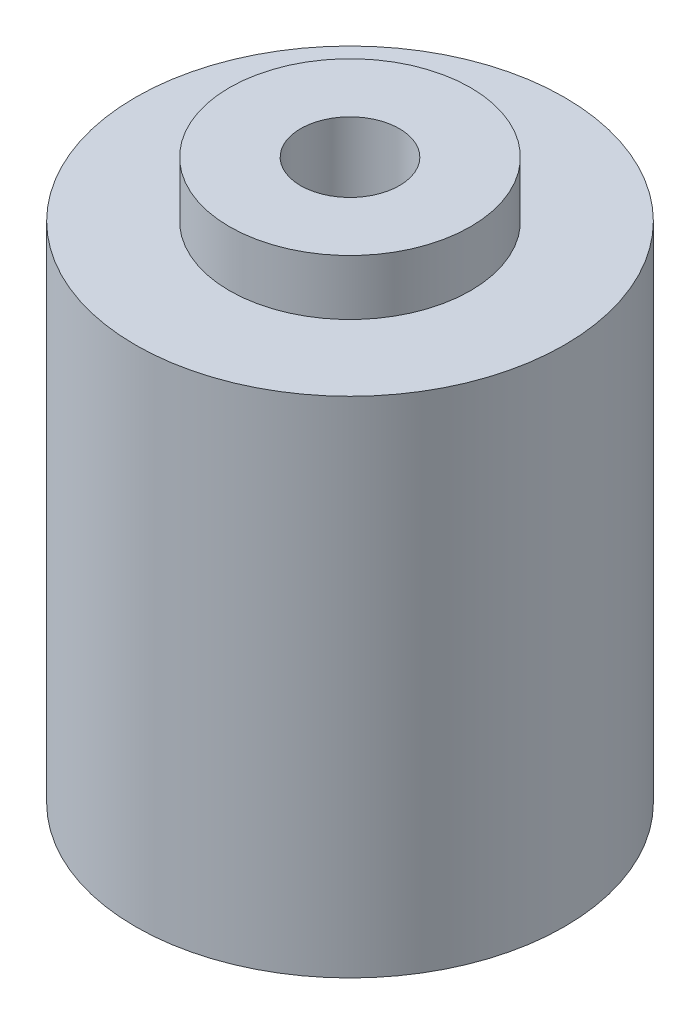
ISO-10303-21;
HEADER;
FILE_DESCRIPTION(('STEP AP214'),'2;1');
FILE_NAME('part.step','',(''),(''),'','','');
FILE_SCHEMA(('AUTOMOTIVE_DESIGN { 1 0 10303 214 1 1 1 1 }'));
ENDSEC;
DATA;
#1=APPLICATION_CONTEXT('core data for automotive mechanical design processes');
#2=APPLICATION_PROTOCOL_DEFINITION('international standard','automotive_design',2000,#1);
#3=PRODUCT_CONTEXT('',#1,'mechanical');
#4=PRODUCT('Part','Part','',(#3));
#5=PRODUCT_RELATED_PRODUCT_CATEGORY('part','',(#4));
#6=PRODUCT_DEFINITION_FORMATION('','',#4);
#7=PRODUCT_DEFINITION_CONTEXT('part definition',#1,'design');
#8=PRODUCT_DEFINITION('design','',#6,#7);
#9=PRODUCT_DEFINITION_SHAPE('','',#8);
#10=(LENGTH_UNIT() NAMED_UNIT(*) SI_UNIT(.MILLI.,.METRE.));
#11=(NAMED_UNIT(*) PLANE_ANGLE_UNIT() SI_UNIT($,.RADIAN.));
#12=(NAMED_UNIT(*) SI_UNIT($,.STERADIAN.) SOLID_ANGLE_UNIT());
#13=UNCERTAINTY_MEASURE_WITH_UNIT(LENGTH_MEASURE(1.E-05),#10,'distance_accuracy_value','');
#14=(GEOMETRIC_REPRESENTATION_CONTEXT(3) GLOBAL_UNCERTAINTY_ASSIGNED_CONTEXT((#13)) GLOBAL_UNIT_ASSIGNED_CONTEXT((#10,
#11,#12)) REPRESENTATION_CONTEXT('',''));
#15=CARTESIAN_POINT('',(0.,0.,0.));
#16=DIRECTION('',(0.,0.,1.));
#17=DIRECTION('',(1.,0.,0.));
#18=AXIS2_PLACEMENT_3D('',#15,#16,#17);
#19=CARTESIAN_POINT('',(0.,56.642,0.));
#20=DIRECTION('',(0.,1.,0.));
#21=DIRECTION('',(0.,0.,1.));
#22=AXIS2_PLACEMENT_3D('',#19,#20,#21);
#23=PLANE('',#22);
#24=CARTESIAN_POINT('',(0.,56.642,0.));
#25=DIRECTION('',(0.,1.,0.));
#26=DIRECTION('',(0.,0.,1.));
#27=AXIS2_PLACEMENT_3D('',#24,#25,#26);
#28=CIRCLE('',#27,12.7);
#29=CARTESIAN_POINT('',(0.,56.642,12.7));
#30=VERTEX_POINT('',#29);
#31=EDGE_CURVE('E44',#30,#30,#28,.T.);
#32=ORIENTED_EDGE('',*,*,#31,.T.);
#33=EDGE_LOOP('',(#32));
#34=FACE_BOUND('',#33,.T.);
#35=CARTESIAN_POINT('',(0.,56.642,0.));
#36=DIRECTION('',(0.,1.,0.));
#37=DIRECTION('',(0.,0.,1.));
#38=AXIS2_PLACEMENT_3D('',#35,#36,#37);
#39=CIRCLE('',#38,5.207);
#40=CARTESIAN_POINT('',(0.,56.642,5.207));
#41=VERTEX_POINT('',#40);
#42=EDGE_CURVE('E78',#41,#41,#39,.F.);
#43=ORIENTED_EDGE('',*,*,#42,.T.);
#44=EDGE_LOOP('',(#43));
#45=FACE_BOUND('',#44,.T.);
#46=ADVANCED_FACE('F31',(#34,#45),#23,.T.);
#47=CARTESIAN_POINT('',(-31.242,40.0328485354983,0.));
#48=DIRECTION('',(1.,0.,0.));
#49=DIRECTION('',(0.,0.,-1.));
#50=AXIS2_PLACEMENT_3D('',#47,#48,#49);
#51=CYLINDRICAL_SURFACE('',#50,2.54);
#52=CARTESIAN_POINT('',(-22.4628501308271,40.0328485354983,-2.54));
#53=CARTESIAN_POINT('',(-22.4628519874032,40.1750374701047,-2.53999389104045));
#54=CARTESIAN_POINT('',(-22.4642147681655,40.3173180215167,-2.52802016972046));
#55=CARTESIAN_POINT('',(-22.4695172855281,40.5979273938752,-2.48043944163731));
#56=CARTESIAN_POINT('',(-22.4734597933094,40.7362517981062,-2.44480701974101));
#57=CARTESIAN_POINT('',(-22.4834696868973,41.0048450130348,-2.35096567384199));
#58=CARTESIAN_POINT('',(-22.4895357124486,41.1351189179149,-2.29277119978632));
#59=CARTESIAN_POINT('',(-22.5031074986739,41.38402452736,-2.15548698602891));
#60=CARTESIAN_POINT('',(-22.5106129919763,41.5026583878112,-2.07640112573769));
#61=CARTESIAN_POINT('',(-22.5262562894873,41.7254825253512,-1.89919307726948));
#62=CARTESIAN_POINT('',(-22.5343965351617,41.8296122598768,-1.80099496957232));
#63=CARTESIAN_POINT('',(-22.5503700816941,42.0199501473025,-1.58851282916985));
#64=CARTESIAN_POINT('',(-22.558203367931,42.1061574473597,-1.47422803140955));
#65=CARTESIAN_POINT('',(-22.5727049836061,42.2584167780123,-1.23244064958391));
#66=CARTESIAN_POINT('',(-22.5793701591329,42.3244145907264,-1.10490371796254));
#67=CARTESIAN_POINT('',(-22.5907578606671,42.4340344788173,-0.840469942861167));
#68=CARTESIAN_POINT('',(-22.5954804455468,42.4776572323034,-0.70357338318103));
#69=CARTESIAN_POINT('',(-22.6024336894632,42.5411094012492,-0.424922198369808));
#70=CARTESIAN_POINT('',(-22.6046748304237,42.5610389263467,-0.283190635107517));
#71=CARTESIAN_POINT('',(-22.6064483926542,42.5768489032878,0.00162197906391579));
#72=CARTESIAN_POINT('',(-22.6059809011429,42.572730129494,0.144702986372428));
#73=CARTESIAN_POINT('',(-22.6023984038634,42.5406412030244,0.427472643970268));
#74=CARTESIAN_POINT('',(-22.5992953480279,42.5127787050554,0.567173683614366));
#75=CARTESIAN_POINT('',(-22.5908039642247,42.434161224935,0.839904193246917));
#76=CARTESIAN_POINT('',(-22.5854156000153,42.3834058797346,0.972933557394618));
#77=CARTESIAN_POINT('',(-22.5729386297922,42.260327089278,1.22888101614845));
#78=CARTESIAN_POINT('',(-22.5658463137905,42.1879564966942,1.3517762505811));
#79=CARTESIAN_POINT('',(-22.5507561788232,42.0237358066609,1.58371749551642));
#80=CARTESIAN_POINT('',(-22.5427583263015,41.931884987231,1.69276299247748));
#81=CARTESIAN_POINT('',(-22.5267013546533,41.7307068517803,1.89454081869313));
#82=CARTESIAN_POINT('',(-22.5186421411332,41.6212858031286,1.98717971158404));
#83=CARTESIAN_POINT('',(-22.5034146212583,41.3883968483323,2.15278996246178));
#84=CARTESIAN_POINT('',(-22.4962463168187,41.2649289119932,2.22576127817096));
#85=CARTESIAN_POINT('',(-22.4836119826784,41.0073738400633,2.34996722880334));
#86=CARTESIAN_POINT('',(-22.478146467629,40.8732835092873,2.40119529373448));
#87=CARTESIAN_POINT('',(-22.4695469380112,40.5983290833005,2.48038247849135));
#88=CARTESIAN_POINT('',(-22.4664128332573,40.4574652503318,2.50834249839377));
#89=CARTESIAN_POINT('',(-22.462847051124,40.1737850058522,2.54007806632914));
#90=CARTESIAN_POINT('',(-22.4624007269563,40.0309834351342,2.54398469351273));
#91=CARTESIAN_POINT('',(-22.4642223539586,39.7467597946001,2.5278475775035));
#92=CARTESIAN_POINT('',(-22.4664902586152,39.6053377011861,2.50780424473977));
#93=CARTESIAN_POINT('',(-22.4734714678958,39.3282745467152,2.44444616215503));
#94=CARTESIAN_POINT('',(-22.4781781853559,39.1926189730874,2.40119408734442));
#95=CARTESIAN_POINT('',(-22.4895013586218,38.9304871617648,2.29271051915275));
#96=CARTESIAN_POINT('',(-22.4961178691913,38.8040111874274,2.22747839547936));
#97=CARTESIAN_POINT('',(-22.5105504098808,38.5632333580757,2.07656090931601));
#98=CARTESIAN_POINT('',(-22.5183714582033,38.4489859884983,1.99078910681833));
#99=CARTESIAN_POINT('',(-22.5343157447023,38.2364625427017,1.80135010598468));
#100=CARTESIAN_POINT('',(-22.5424389923374,38.1381869668984,1.69768234715611));
#101=CARTESIAN_POINT('',(-22.5581169865897,37.9599408254114,1.47482367046936));
#102=CARTESIAN_POINT('',(-22.5656689622914,37.8800560620802,1.35556390401831));
#103=CARTESIAN_POINT('',(-22.5793126823684,37.7414511289438,1.10524415651504));
#104=CARTESIAN_POINT('',(-22.5854044512383,37.6827306041031,0.974184373457117));
#105=CARTESIAN_POINT('',(-22.5954289778261,37.5882646731895,0.704277664654601));
#106=CARTESIAN_POINT('',(-22.5993665041631,37.552468491692,0.565448694411506));
#107=CARTESIAN_POINT('',(-22.6046585772855,37.504701893486,0.283704081925971));
#108=CARTESIAN_POINT('',(-22.6060132170987,37.4927306186762,0.140788587055907));
#109=CARTESIAN_POINT('',(-22.605986658336,37.4929675593847,-0.144231820228776));
#110=CARTESIAN_POINT('',(-22.6046204828274,37.5050430001734,-0.286336862908438));
#111=CARTESIAN_POINT('',(-22.5993355218844,37.5527508693765,-0.566485231636046));
#112=CARTESIAN_POINT('',(-22.5954167360394,37.5883833015808,-0.704528557030542));
#113=CARTESIAN_POINT('',(-22.5854652391025,37.6821545375996,-0.972626159162659));
#114=CARTESIAN_POINT('',(-22.5794330037321,37.740288276849,-1.10268222603516));
#115=CARTESIAN_POINT('',(-22.5659249337232,37.877398082395,-1.35121278152815));
#116=CARTESIAN_POINT('',(-22.55844909544,37.9563742013131,-1.46968724090712));
#117=CARTESIAN_POINT('',(-22.5428405804059,38.1334221649662,-1.69237129060322));
#118=CARTESIAN_POINT('',(-22.5347046342477,38.2315929404367,-1.79650199861406));
#119=CARTESIAN_POINT('',(-22.5187199313993,38.444042025158,-1.98686672798467));
#120=CARTESIAN_POINT('',(-22.510871243632,38.5583241685561,-2.07309647720167));
#121=CARTESIAN_POINT('',(-22.4963233805864,38.8001558792157,-2.22543539264269));
#122=CARTESIAN_POINT('',(-22.4896278979147,38.9277460396272,-2.29148043089939));
#123=CARTESIAN_POINT('',(-22.4781880826128,39.1922043809881,-2.40111693582597));
#124=CARTESIAN_POINT('',(-22.4734415870136,39.3290620792577,-2.44473330727969));
#125=CARTESIAN_POINT('',(-22.4676135081654,39.5610286055879,-2.49759946996118));
#126=CARTESIAN_POINT('',(-22.4658358963525,39.6546631586349,-2.51347741489973));
#127=CARTESIAN_POINT('',(-22.4634535915994,39.8431343936707,-2.53467968811047));
#128=CARTESIAN_POINT('',(-22.4628488920019,39.9379710688331,-2.5400040762849));
#129=CARTESIAN_POINT('',(-22.4628501308271,40.0328485354983,-2.54));
#130=B_SPLINE_CURVE_WITH_KNOTS('',3,(#52,#53,#54,#55,#56,#57,#58,#59,#60,#61,#62,#63,#64,#65,
#66,#67,#68,#69,#70,#71,#72,#73,#74,#75,#76,#77,#78,#79,#80,#81,#82,#83,#84,#85,#86,#87,#88,#89,
#90,#91,#92,#93,#94,#95,#96,#97,#98,#99,#100,#101,#102,#103,#104,#105,#106,#107,#108,#109,#110,
#111,#112,#113,#114,#115,#116,#117,#118,#119,#120,#121,#122,#123,#124,#125,#126,#127,#128,#129),
.UNSPECIFIED.,.T.,.F.,(4,2,2,2,2,2,2,2,2,2,2,2,2,2,2,2,2,2,2,2,2,2,2,2,2,2,2,2,2,2,2,2,2,2,2,2,
2,2,4),(0.,0.426220270683095,0.852899146810548,1.27930520514525,1.70563213791538,
2.13368846656337,2.56176515970774,2.99098043086953,3.42018269325996,3.84756495267951,
4.27493345033565,4.70037449438917,5.1258222855882,5.55220492905823,5.9786033779786,
6.40735712896543,6.83611180159896,7.26499593568647,7.69386347849785,8.12039182070828,
8.54691285363164,8.97228782452974,9.39767499437269,9.82488485460679,10.2521080972729,
10.6812858854325,11.1104564736933,11.5386731684687,11.9668744398897,12.3927179393588,
12.8185615073376,13.2443092826801,13.6700581329324,14.0980620956674,14.5261680863067,
14.9556203839569,15.3845947825754,15.6689975679865,15.953398739116),.UNSPECIFIED.);
#131=CARTESIAN_POINT('',(-22.4628501308271,40.0328485354983,-2.54));
#132=VERTEX_POINT('',#131);
#133=EDGE_CURVE('E48',#132,#132,#130,.T.);
#134=ORIENTED_EDGE('',*,*,#133,.F.);
#135=EDGE_LOOP('',(#134));
#136=FACE_BOUND('',#135,.T.);
#137=CARTESIAN_POINT('',(-4.54546466271601,40.0328485354983,-2.54));
#138=CARTESIAN_POINT('',(-4.54547667675655,39.9000025587801,-2.53998988471664));
#139=CARTESIAN_POINT('',(-4.55137679808838,39.7669726341735,-2.52950821226168));
#140=CARTESIAN_POINT('',(-4.57414015223855,39.5049586782205,-2.48809442556826));
#141=CARTESIAN_POINT('',(-4.59102753532897,39.3759842171076,-2.45711725918423));
#142=CARTESIAN_POINT('',(-4.63334647815251,39.1263574526049,-2.37634116328109));
#143=CARTESIAN_POINT('',(-4.65873425737187,39.0056662490605,-2.32663851663548));
#144=CARTESIAN_POINT('',(-4.7151264153585,38.7743650737305,-2.21011495781394));
#145=CARTESIAN_POINT('',(-4.7461308599076,38.6637552200394,-2.14329384514439));
#146=CARTESIAN_POINT('',(-4.81323349005063,38.4461825415435,-1.98829032157754));
#147=CARTESIAN_POINT('',(-4.8495404302748,38.3401833759878,-1.89884501468683));
#148=CARTESIAN_POINT('',(-4.92146851791136,38.1439470166116,-1.7037623934225));
#149=CARTESIAN_POINT('',(-4.95708932977139,38.0537173690753,-1.59811737204997));
#150=CARTESIAN_POINT('',(-5.02633499270512,37.8859903546343,-1.36544256593427));
#151=CARTESIAN_POINT('',(-5.0596901138471,37.8096629201755,-1.23748162630202));
#152=CARTESIAN_POINT('',(-5.11796085631138,37.6800552114383,-0.968604679916625));
#153=CARTESIAN_POINT('',(-5.14288155052872,37.6267610783942,-0.827696525361274));
#154=CARTESIAN_POINT('',(-5.17997519210143,37.5484982202949,-0.547121451382447));
#155=CARTESIAN_POINT('',(-5.19290231168105,37.5218440365565,-0.40802660154889));
#156=CARTESIAN_POINT('',(-5.20735606322798,37.4920832208046,-0.126783441656181));
#157=CARTESIAN_POINT('',(-5.20888921577637,37.4889631206046,0.0153630752611582));
#158=CARTESIAN_POINT('',(-5.20075364726631,37.5056717556195,0.286069246976375));
#159=CARTESIAN_POINT('',(-5.19200266648174,37.5236202097392,0.414778690277974));
#160=CARTESIAN_POINT('',(-5.16564962015747,37.5786138675708,0.667087803810721));
#161=CARTESIAN_POINT('',(-5.14804689464034,37.615660495229,0.790687092289975));
#162=CARTESIAN_POINT('',(-5.10529998606409,37.7080827123572,1.03147569436116));
#163=CARTESIAN_POINT('',(-5.08005145109191,37.7637130969198,1.14854791693069));
#164=CARTESIAN_POINT('',(-5.02431887390253,37.8913940292473,1.37198701644195));
#165=CARTESIAN_POINT('',(-4.99383293297209,37.9634505350709,1.47834998870871));
#166=CARTESIAN_POINT('',(-4.92724131645636,38.1294940381142,1.68768429043921));
#167=CARTESIAN_POINT('',(-4.89087669235588,38.2248808794182,1.78946394263114));
#168=CARTESIAN_POINT('',(-4.81845469431621,38.4311065336682,1.97620732176552));
#169=CARTESIAN_POINT('',(-4.78239755408554,38.5419561510925,2.06115918911979));
#170=CARTESIAN_POINT('',(-4.7124280634561,38.783894577806,2.2166564664036));
#171=CARTESIAN_POINT('',(-4.67876283100497,38.9157860153195,2.2860750667633));
#172=CARTESIAN_POINT('',(-4.62073708832255,39.191415988001,2.40121595996187));
#173=CARTESIAN_POINT('',(-4.59636727702021,39.3351425048274,2.44696195623257));
#174=CARTESIAN_POINT('',(-4.5623122145383,39.6185528970546,2.50985067852113));
#175=CARTESIAN_POINT('',(-4.55163140627399,39.7576803183873,2.52894303886585));
#176=CARTESIAN_POINT('',(-4.54332099957662,40.0375295472541,2.54385073866861));
#177=CARTESIAN_POINT('',(-4.54568315304136,40.1782502910218,2.53968078871862));
#178=CARTESIAN_POINT('',(-4.56213881368828,40.442069967304,2.50997142011857));
#179=CARTESIAN_POINT('',(-4.57501555249265,40.5655062465647,2.48664705619096));
#180=CARTESIAN_POINT('',(-4.609288595841,40.8065011578108,2.42252327266023));
#181=CARTESIAN_POINT('',(-4.63068750064784,40.9240579835377,2.38171851919472));
#182=CARTESIAN_POINT('',(-4.68076779308422,41.1561446309945,2.28177814863591));
#183=CARTESIAN_POINT('',(-4.70974118189156,41.270280470391,2.22187937748644));
#184=CARTESIAN_POINT('',(-4.77142256389308,41.4875291529,2.08612828528941));
#185=CARTESIAN_POINT('',(-4.8041324539702,41.590636345287,2.01026784449467));
#186=CARTESIAN_POINT('',(-4.87427488923865,41.7957069643773,1.83420046598006));
#187=CARTESIAN_POINT('',(-4.91180685796537,41.8960794926536,1.73217186012291));
#188=CARTESIAN_POINT('',(-4.98396367575647,42.0787451603011,1.51207251238271));
#189=CARTESIAN_POINT('',(-5.01858768748697,42.1610331032453,1.39399717536145));
#190=CARTESIAN_POINT('',(-5.08202694936583,42.3066433301596,1.14154748141194));
#191=CARTESIAN_POINT('',(-5.11069964287749,42.3695146868678,1.00687472702268));
#192=CARTESIAN_POINT('',(-5.15793451468967,42.4711013807979,0.727065482416313));
#193=CARTESIAN_POINT('',(-5.17650514175679,42.5098369077457,0.581937851441876));
#194=CARTESIAN_POINT('',(-5.20015406712463,42.5588658680853,0.299259979511798));
#195=CARTESIAN_POINT('',(-5.20628442288042,42.5713803085026,0.162181933379557));
#196=CARTESIAN_POINT('',(-5.20759576105782,42.5740711346472,-0.112226661463704));
#197=CARTESIAN_POINT('',(-5.20278021110173,42.5642545947455,-0.24955711644069));
#198=CARTESIAN_POINT('',(-5.18335369590967,42.5240697300642,-0.511811269636983));
#199=CARTESIAN_POINT('',(-5.1693555465016,42.494986096665,-0.636981863135018));
#200=CARTESIAN_POINT('',(-5.13349270574902,42.4187710098086,-0.880487706609356));
#201=CARTESIAN_POINT('',(-5.11162683260573,42.3716368449402,-0.998821926603698));
#202=CARTESIAN_POINT('',(-5.06082492344598,42.2584641528885,-1.23112162645493));
#203=CARTESIAN_POINT('',(-5.0316201840543,42.1916852330737,-1.34466593450256));
#204=CARTESIAN_POINT('',(-4.96926370879988,42.0420668561959,-1.55942039050428));
#205=CARTESIAN_POINT('',(-4.93611015910619,41.9592200074899,-1.66062482678173));
#206=CARTESIAN_POINT('',(-4.86547257261836,41.7706399440889,-1.85796328948389));
#207=CARTESIAN_POINT('',(-4.82787669779465,41.6634789626035,-1.95269797783151));
#208=CARTESIAN_POINT('',(-4.75531643109364,41.43414729153,-2.12330563844394));
#209=CARTESIAN_POINT('',(-4.72035419651765,41.3119645081408,-2.19916326255816));
#210=CARTESIAN_POINT('',(-4.65653052431585,41.0517696788893,-2.33133716943511));
#211=CARTESIAN_POINT('',(-4.62783909740456,40.9134437172294,-2.38713048011731));
#212=CARTESIAN_POINT('',(-4.59351527000725,40.6992782944948,-2.4521520448008));
#213=CARTESIAN_POINT('',(-4.58353136844025,40.6268462844541,-2.47070604544838));
#214=CARTESIAN_POINT('',(-4.56685513367202,40.480281130321,-2.50139842437502));
#215=CARTESIAN_POINT('',(-4.56016046020363,40.4061492351085,-2.51354136454746));
#216=CARTESIAN_POINT('',(-4.55202192781275,40.2820405912778,-2.52823822637844));
#217=CARTESIAN_POINT('',(-4.54956892619652,40.2323400454628,-2.53264444414535));
#218=CARTESIAN_POINT('',(-4.54628798479975,40.1327178550284,-2.53852732324791));
#219=CARTESIAN_POINT('',(-4.54546014565615,40.0827961969087,-2.54000380316183));
#220=CARTESIAN_POINT('',(-4.54546466271601,40.0328485354983,-2.54));
#221=B_SPLINE_CURVE_WITH_KNOTS('',3,(#137,#138,#139,#140,#141,#142,#143,#144,#145,#146,#147,
#148,#149,#150,#151,#152,#153,#154,#155,#156,#157,#158,#159,#160,#161,#162,#163,#164,#165,#166,
#167,#168,#169,#170,#171,#172,#173,#174,#175,#176,#177,#178,#179,#180,#181,#182,#183,#184,#185,
#186,#187,#188,#189,#190,#191,#192,#193,#194,#195,#196,#197,#198,#199,#200,#201,#202,#203,#204,
#205,#206,#207,#208,#209,#210,#211,#212,#213,#214,#215,#216,#217,#218,#219,#220),.UNSPECIFIED.,
.T.,.F.,(4,2,2,2,2,2,2,2,2,2,2,2,2,2,2,2,2,2,2,2,2,2,2,2,2,2,2,2,2,2,2,2,2,2,2,2,2,2,2,2,2,4),
(0.,0.39833663098746,0.797551787196278,1.19474166522023,1.591936195394,2.02023030036498,
2.44872880167978,2.90439450454201,3.35978565772232,3.78408561265651,4.20814272895015,
4.59705940038754,4.98600507337178,5.38051867417794,5.77517560071154,6.20578525277129,
6.6366973109082,7.09269911652004,7.54824343867116,7.96832111267191,8.38813316858115,
8.76527583956718,9.14253367169152,9.53730801813841,9.93228367506939,10.3741796964669,
10.8162025267939,11.2678294878647,11.7190781520527,12.1302392799798,12.5412701717416,
12.9273320351728,13.3134519125922,13.7165572034974,14.1198483744969,14.5615231743914,
15.0035559168122,15.4563932875891,15.6823994002657,15.9082444771671,16.0580025032279,
16.2077698026484),.UNSPECIFIED.);
#222=CARTESIAN_POINT('',(-4.54546466271601,40.0328485354983,-2.54));
#223=VERTEX_POINT('',#222);
#224=EDGE_CURVE('E72',#223,#223,#221,.T.);
#225=ORIENTED_EDGE('',*,*,#224,.F.);
#226=EDGE_LOOP('',(#225));
#227=FACE_BOUND('',#226,.T.);
#228=ADVANCED_FACE('F61',(#136,#227),#51,.F.);
#229=CARTESIAN_POINT('',(-31.242,15.4281247214263,0.));
#230=DIRECTION('',(1.,0.,0.));
#231=DIRECTION('',(0.,0.,-1.));
#232=AXIS2_PLACEMENT_3D('',#229,#230,#231);
#233=CYLINDRICAL_SURFACE('',#232,2.54);
#234=CARTESIAN_POINT('',(-22.4628501308271,15.4281247214263,-2.54));
#235=CARTESIAN_POINT('',(-22.4628519874032,15.5703136560328,-2.53999389104045));
#236=CARTESIAN_POINT('',(-22.4642147681655,15.7125942074448,-2.52802016972046));
#237=CARTESIAN_POINT('',(-22.4695172855281,15.9932035798032,-2.48043944163731));
#238=CARTESIAN_POINT('',(-22.4734597933094,16.1315279840342,-2.44480701974101));
#239=CARTESIAN_POINT('',(-22.4834696868973,16.4001211989628,-2.35096567384199));
#240=CARTESIAN_POINT('',(-22.4895357124486,16.5303951038429,-2.29277119978632));
#241=CARTESIAN_POINT('',(-22.5031074986739,16.7793007132881,-2.15548698602891));
#242=CARTESIAN_POINT('',(-22.5106129919763,16.8979345737392,-2.0764011257377));
#243=CARTESIAN_POINT('',(-22.5262562894873,17.1207587112793,-1.89919307726949));
#244=CARTESIAN_POINT('',(-22.5343965351617,17.2248884458048,-1.80099496957233));
#245=CARTESIAN_POINT('',(-22.5503700816941,17.4152263332306,-1.58851282916985));
#246=CARTESIAN_POINT('',(-22.558203367931,17.5014336332877,-1.47422803140956));
#247=CARTESIAN_POINT('',(-22.5727049836061,17.6536929639403,-1.23244064958392));
#248=CARTESIAN_POINT('',(-22.5793701591329,17.7196907766544,-1.10490371796255));
#249=CARTESIAN_POINT('',(-22.5907578606671,17.8293106647453,-0.840469942861169));
#250=CARTESIAN_POINT('',(-22.5954804455468,17.8729334182314,-0.703573383181032));
#251=CARTESIAN_POINT('',(-22.6024336894632,17.9363855871773,-0.424922198369809));
#252=CARTESIAN_POINT('',(-22.6046748304237,17.9563151122747,-0.283190635107518));
#253=CARTESIAN_POINT('',(-22.6064483926542,17.9721250892158,0.0016219790639134));
#254=CARTESIAN_POINT('',(-22.6059809011429,17.968006315422,0.144702986372426));
#255=CARTESIAN_POINT('',(-22.6023984038634,17.9359173889525,0.427472643970264));
#256=CARTESIAN_POINT('',(-22.5992953480279,17.9080548909835,0.567173683614362));
#257=CARTESIAN_POINT('',(-22.5908039642247,17.8294374108631,0.839904193246913));
#258=CARTESIAN_POINT('',(-22.5854156000153,17.7786820656626,0.972933557394615));
#259=CARTESIAN_POINT('',(-22.5729386297922,17.6556032752061,1.22888101614844));
#260=CARTESIAN_POINT('',(-22.5658463137905,17.5832326826223,1.35177625058109));
#261=CARTESIAN_POINT('',(-22.5507561788232,17.419011992589,1.58371749551641));
#262=CARTESIAN_POINT('',(-22.5427583263015,17.327161173159,1.69276299247747));
#263=CARTESIAN_POINT('',(-22.5267013546533,17.1259830377084,1.89454081869313));
#264=CARTESIAN_POINT('',(-22.5186421411332,17.0165619890566,1.98717971158404));
#265=CARTESIAN_POINT('',(-22.5034146212583,16.7836730342603,2.15278996246178));
#266=CARTESIAN_POINT('',(-22.4962463168187,16.6602050979213,2.22576127817096));
#267=CARTESIAN_POINT('',(-22.4836119826784,16.4026500259913,2.34996722880334));
#268=CARTESIAN_POINT('',(-22.478146467629,16.2685596952153,2.40119529373448));
#269=CARTESIAN_POINT('',(-22.4695469380112,15.9936052692286,2.48038247849135));
#270=CARTESIAN_POINT('',(-22.4664128332573,15.8527414362599,2.50834249839377));
#271=CARTESIAN_POINT('',(-22.462847051124,15.5690611917803,2.54007806632914));
#272=CARTESIAN_POINT('',(-22.4624007269563,15.4262596210622,2.54398469351273));
#273=CARTESIAN_POINT('',(-22.4642223539586,15.1420359805282,2.5278475775035));
#274=CARTESIAN_POINT('',(-22.4664902586152,15.0006138871141,2.50780424473977));
#275=CARTESIAN_POINT('',(-22.4734714678958,14.7235507326432,2.44444616215503));
#276=CARTESIAN_POINT('',(-22.4781781853559,14.5878951590155,2.40119408734442));
#277=CARTESIAN_POINT('',(-22.4895013586218,14.3257633476929,2.29271051915276));
#278=CARTESIAN_POINT('',(-22.4961178691913,14.1992873733555,2.22747839547936));
#279=CARTESIAN_POINT('',(-22.5105504098808,13.9585095440038,2.07656090931602));
#280=CARTESIAN_POINT('',(-22.5183714582033,13.8442621744264,1.99078910681834));
#281=CARTESIAN_POINT('',(-22.5343157447023,13.6317387286297,1.80135010598468));
#282=CARTESIAN_POINT('',(-22.5424389923374,13.5334631528265,1.69768234715611));
#283=CARTESIAN_POINT('',(-22.5581169865897,13.3552170113394,1.47482367046936));
#284=CARTESIAN_POINT('',(-22.5656689622914,13.2753322480083,1.35556390401831));
#285=CARTESIAN_POINT('',(-22.5793126823684,13.1367273148718,1.10524415651504));
#286=CARTESIAN_POINT('',(-22.5854044512383,13.0780067900311,0.974184373457121));
#287=CARTESIAN_POINT('',(-22.5954289778261,12.9835408591176,0.704277664654605));
#288=CARTESIAN_POINT('',(-22.5993665041631,12.94774467762,0.56544869441151));
#289=CARTESIAN_POINT('',(-22.6046585772855,12.8999780794141,0.283704081925974));
#290=CARTESIAN_POINT('',(-22.6060132170987,12.8880068046043,0.14078858705591));
#291=CARTESIAN_POINT('',(-22.605986658336,12.8882437453127,-0.144231820228773));
#292=CARTESIAN_POINT('',(-22.6046204828274,12.9003191861014,-0.286336862908434));
#293=CARTESIAN_POINT('',(-22.5993355218844,12.9480270553046,-0.566485231636042));
#294=CARTESIAN_POINT('',(-22.5954167360394,12.9836594875088,-0.704528557030538));
#295=CARTESIAN_POINT('',(-22.5854652391025,13.0774307235276,-0.972626159162655));
#296=CARTESIAN_POINT('',(-22.5794330037321,13.135564462777,-1.10268222603516));
#297=CARTESIAN_POINT('',(-22.5659249337232,13.2726742683231,-1.35121278152814));
#298=CARTESIAN_POINT('',(-22.55844909544,13.3516503872411,-1.46968724090712));
#299=CARTESIAN_POINT('',(-22.5428405804059,13.5286983508942,-1.69237129060322));
#300=CARTESIAN_POINT('',(-22.5347046342477,13.6268691263647,-1.79650199861406));
#301=CARTESIAN_POINT('',(-22.5187199313993,13.839318211086,-1.98686672798468));
#302=CARTESIAN_POINT('',(-22.510871243632,13.9536003544842,-2.07309647720167));
#303=CARTESIAN_POINT('',(-22.4963233805864,14.1954320651438,-2.22543539264269));
#304=CARTESIAN_POINT('',(-22.4896278979147,14.3230222255553,-2.29148043089939));
#305=CARTESIAN_POINT('',(-22.4781880826128,14.5874805669161,-2.40111693582597));
#306=CARTESIAN_POINT('',(-22.4734415870136,14.7243382651858,-2.44473330727969));
#307=CARTESIAN_POINT('',(-22.4676135081654,14.9563047915159,-2.49759946996118));
#308=CARTESIAN_POINT('',(-22.4658358963525,15.049939344563,-2.51347741489973));
#309=CARTESIAN_POINT('',(-22.4634535915994,15.2384105795987,-2.53467968811047));
#310=CARTESIAN_POINT('',(-22.4628488920019,15.3332472547612,-2.5400040762849));
#311=CARTESIAN_POINT('',(-22.4628501308271,15.4281247214263,-2.54));
#312=B_SPLINE_CURVE_WITH_KNOTS('',3,(#234,#235,#236,#237,#238,#239,#240,#241,#242,#243,#244,
#245,#246,#247,#248,#249,#250,#251,#252,#253,#254,#255,#256,#257,#258,#259,#260,#261,#262,#263,
#264,#265,#266,#267,#268,#269,#270,#271,#272,#273,#274,#275,#276,#277,#278,#279,#280,#281,#282,
#283,#284,#285,#286,#287,#288,#289,#290,#291,#292,#293,#294,#295,#296,#297,#298,#299,#300,#301,
#302,#303,#304,#305,#306,#307,#308,#309,#310,#311),.UNSPECIFIED.,.T.,.F.,(4,2,2,2,2,2,2,2,2,2,2,
2,2,2,2,2,2,2,2,2,2,2,2,2,2,2,2,2,2,2,2,2,2,2,2,2,2,2,4),(0.,0.426220270683098,
0.852899146810544,1.27930520514524,1.70563213791537,2.13368846656336,2.56176515970774,
2.99098043086953,3.42018269325996,3.8475649526795,4.27493345033565,4.70037449438917,
5.1258222855882,5.55220492905821,5.9786033779786,6.40735712896543,6.83611180159895,
7.26499593568647,7.69386347849785,8.12039182070827,8.54691285363163,8.97228782452973,
9.39767499437269,9.82488485460679,10.2521080972729,10.6812858854325,11.1104564736933,
11.5386731684687,11.9668744398897,12.3927179393588,12.8185615073376,13.2443092826801,
13.6700581329324,14.0980620956674,14.5261680863067,14.9556203839569,15.3845947825754,
15.6689975679865,15.953398739116),.UNSPECIFIED.);
#313=CARTESIAN_POINT('',(-22.4628501308271,15.4281247214263,-2.54));
#314=VERTEX_POINT('',#313);
#315=EDGE_CURVE('E54',#314,#314,#312,.T.);
#316=ORIENTED_EDGE('',*,*,#315,.F.);
#317=EDGE_LOOP('',(#316));
#318=FACE_BOUND('',#317,.T.);
#319=CARTESIAN_POINT('',(-4.54546466271601,15.4281247214263,-2.54));
#320=CARTESIAN_POINT('',(-4.54547667675655,15.2952787447081,-2.53998988471664));
#321=CARTESIAN_POINT('',(-4.55137679808838,15.1622488201015,-2.52950821226168));
#322=CARTESIAN_POINT('',(-4.57414015223854,14.9002348641485,-2.48809442556826));
#323=CARTESIAN_POINT('',(-4.59102753532897,14.7712604030356,-2.45711725918423));
#324=CARTESIAN_POINT('',(-4.63334647815252,14.521633638533,-2.37634116328109));
#325=CARTESIAN_POINT('',(-4.65873425737187,14.4009424349885,-2.32663851663548));
#326=CARTESIAN_POINT('',(-4.7151264153585,14.1696412596585,-2.21011495781393));
#327=CARTESIAN_POINT('',(-4.74613085990761,14.0590314059675,-2.14329384514439));
#328=CARTESIAN_POINT('',(-4.81323349005063,13.8414587274715,-1.98829032157754));
#329=CARTESIAN_POINT('',(-4.8495404302748,13.7354595619159,-1.89884501468683));
#330=CARTESIAN_POINT('',(-4.92146851791136,13.5392232025397,-1.7037623934225));
#331=CARTESIAN_POINT('',(-4.95708932977139,13.4489935550034,-1.59811737204997));
#332=CARTESIAN_POINT('',(-5.02633499270512,13.2812665405623,-1.36544256593427));
#333=CARTESIAN_POINT('',(-5.0596901138471,13.2049391061036,-1.23748162630202));
#334=CARTESIAN_POINT('',(-5.11796085631138,13.0753313973663,-0.968604679916625));
#335=CARTESIAN_POINT('',(-5.14288155052872,13.0220372643222,-0.827696525361274));
#336=CARTESIAN_POINT('',(-5.17997519210143,12.9437744062229,-0.547121451382447));
#337=CARTESIAN_POINT('',(-5.19290231168105,12.9171202224845,-0.40802660154889));
#338=CARTESIAN_POINT('',(-5.20735606322798,12.8873594067327,-0.12678344165618));
#339=CARTESIAN_POINT('',(-5.20888921577637,12.8842393065326,0.0153630752611591));
#340=CARTESIAN_POINT('',(-5.20075364726631,12.9009479415475,0.286069246976376));
#341=CARTESIAN_POINT('',(-5.19200266648174,12.9188963956672,0.414778690277974));
#342=CARTESIAN_POINT('',(-5.16564962015747,12.9738900534988,0.667087803810721));
#343=CARTESIAN_POINT('',(-5.14804689464034,13.010936681157,0.790687092289975));
#344=CARTESIAN_POINT('',(-5.10529998606409,13.1033588982853,1.03147569436116));
#345=CARTESIAN_POINT('',(-5.08005145109191,13.1589892828478,1.14854791693069));
#346=CARTESIAN_POINT('',(-5.02431887390253,13.2866702151753,1.37198701644196));
#347=CARTESIAN_POINT('',(-4.99383293297209,13.358726720999,1.47834998870871));
#348=CARTESIAN_POINT('',(-4.92724131645636,13.5247702240422,1.68768429043921));
#349=CARTESIAN_POINT('',(-4.89087669235588,13.6201570653462,1.78946394263115));
#350=CARTESIAN_POINT('',(-4.81845469431621,13.8263827195962,1.97620732176552));
#351=CARTESIAN_POINT('',(-4.78239755408554,13.9372323370206,2.06115918911979));
#352=CARTESIAN_POINT('',(-4.7124280634561,14.1791707637341,2.2166564664036));
#353=CARTESIAN_POINT('',(-4.67876283100498,14.3110622012475,2.2860750667633));
#354=CARTESIAN_POINT('',(-4.62073708832255,14.586692173929,2.40121595996187));
#355=CARTESIAN_POINT('',(-4.59636727702021,14.7304186907554,2.44696195623257));
#356=CARTESIAN_POINT('',(-4.5623122145383,15.0138290829827,2.50985067852113));
#357=CARTESIAN_POINT('',(-4.55163140627399,15.1529565043153,2.52894303886585));
#358=CARTESIAN_POINT('',(-4.54332099957662,15.4328057331822,2.54385073866861));
#359=CARTESIAN_POINT('',(-4.54568315304136,15.5735264769499,2.53968078871862));
#360=CARTESIAN_POINT('',(-4.56213881368828,15.8373461532321,2.50997142011857));
#361=CARTESIAN_POINT('',(-4.57501555249265,15.9607824324927,2.48664705619096));
#362=CARTESIAN_POINT('',(-4.609288595841,16.2017773437388,2.42252327266023));
#363=CARTESIAN_POINT('',(-4.63068750064784,16.3193341694657,2.38171851919472));
#364=CARTESIAN_POINT('',(-4.68076779308421,16.5514208169225,2.28177814863592));
#365=CARTESIAN_POINT('',(-4.70974118189156,16.6655566563191,2.22187937748644));
#366=CARTESIAN_POINT('',(-4.77142256389308,16.8828053388281,2.08612828528941));
#367=CARTESIAN_POINT('',(-4.8041324539702,16.9859125312151,2.01026784449467));
#368=CARTESIAN_POINT('',(-4.87427488923865,17.1909831503053,1.83420046598006));
#369=CARTESIAN_POINT('',(-4.91180685796537,17.2913556785816,1.73217186012291));
#370=CARTESIAN_POINT('',(-4.98396367575647,17.4740213462292,1.51207251238271));
#371=CARTESIAN_POINT('',(-5.01858768748697,17.5563092891733,1.39399717536145));
#372=CARTESIAN_POINT('',(-5.08202694936583,17.7019195160877,1.14154748141194));
#373=CARTESIAN_POINT('',(-5.11069964287749,17.7647908727959,1.00687472702268));
#374=CARTESIAN_POINT('',(-5.15793451468967,17.8663775667259,0.72706548241631));
#375=CARTESIAN_POINT('',(-5.17650514175679,17.9051130936737,0.581937851441874));
#376=CARTESIAN_POINT('',(-5.20015406712463,17.9541420540133,0.299259979511795));
#377=CARTESIAN_POINT('',(-5.20628442288042,17.9666564944306,0.162181933379554));
#378=CARTESIAN_POINT('',(-5.20759576105782,17.9693473205752,-0.112226661463706));
#379=CARTESIAN_POINT('',(-5.20278021110173,17.9595307806736,-0.249557116440692));
#380=CARTESIAN_POINT('',(-5.18335369590967,17.9193459159922,-0.511811269636985));
#381=CARTESIAN_POINT('',(-5.1693555465016,17.890262282593,-0.63698186313502));
#382=CARTESIAN_POINT('',(-5.13349270574902,17.8140471957366,-0.880487706609358));
#383=CARTESIAN_POINT('',(-5.11162683260574,17.7669130308683,-0.998821926603699));
#384=CARTESIAN_POINT('',(-5.06082492344598,17.6537403388165,-1.23112162645493));
#385=CARTESIAN_POINT('',(-5.0316201840543,17.5869614190017,-1.34466593450256));
#386=CARTESIAN_POINT('',(-4.96926370879987,17.4373430421239,-1.55942039050428));
#387=CARTESIAN_POINT('',(-4.93611015910619,17.354496193418,-1.66062482678173));
#388=CARTESIAN_POINT('',(-4.86547257261836,17.165916130017,-1.85796328948389));
#389=CARTESIAN_POINT('',(-4.82787669779465,17.0587551485316,-1.95269797783151));
#390=CARTESIAN_POINT('',(-4.75531643109364,16.829423477458,-2.12330563844394));
#391=CARTESIAN_POINT('',(-4.72035419651765,16.7072406940688,-2.19916326255816));
#392=CARTESIAN_POINT('',(-4.65653052431585,16.4470458648174,-2.33133716943511));
#393=CARTESIAN_POINT('',(-4.62783909740456,16.3087199031574,-2.38713048011731));
#394=CARTESIAN_POINT('',(-4.59351527000726,16.0945544804229,-2.45215204480079));
#395=CARTESIAN_POINT('',(-4.58353136844025,16.0221224703822,-2.47070604544837));
#396=CARTESIAN_POINT('',(-4.56685513367202,15.8755573162491,-2.50139842437502));
#397=CARTESIAN_POINT('',(-4.56016046020363,15.8014254210366,-2.51354136454746));
#398=CARTESIAN_POINT('',(-4.55202192781275,15.6773167772058,-2.52823822637844));
#399=CARTESIAN_POINT('',(-4.54956892619652,15.6276162313908,-2.53264444414535));
#400=CARTESIAN_POINT('',(-4.54628798479975,15.5279940409565,-2.53852732324791));
#401=CARTESIAN_POINT('',(-4.54546014565615,15.4780723828368,-2.54000380316183));
#402=CARTESIAN_POINT('',(-4.54546466271601,15.4281247214263,-2.54));
#403=B_SPLINE_CURVE_WITH_KNOTS('',3,(#319,#320,#321,#322,#323,#324,#325,#326,#327,#328,#329,
#330,#331,#332,#333,#334,#335,#336,#337,#338,#339,#340,#341,#342,#343,#344,#345,#346,#347,#348,
#349,#350,#351,#352,#353,#354,#355,#356,#357,#358,#359,#360,#361,#362,#363,#364,#365,#366,#367,
#368,#369,#370,#371,#372,#373,#374,#375,#376,#377,#378,#379,#380,#381,#382,#383,#384,#385,#386,
#387,#388,#389,#390,#391,#392,#393,#394,#395,#396,#397,#398,#399,#400,#401,#402),.UNSPECIFIED.,
.T.,.F.,(4,2,2,2,2,2,2,2,2,2,2,2,2,2,2,2,2,2,2,2,2,2,2,2,2,2,2,2,2,2,2,2,2,2,2,2,2,2,2,2,2,4),
(0.,0.398336630987453,0.79755178719628,1.19474166522023,1.59193619539401,2.02023030036498,
2.44872880167978,2.90439450454201,3.35978565772232,3.78408561265651,4.20814272895015,
4.59705940038755,4.98600507337178,5.38051867417794,5.77517560071155,6.20578525277129,
6.6366973109082,7.09269911652003,7.54824343867116,7.9683211126719,8.38813316858116,
8.76527583956718,9.14253367169152,9.53730801813841,9.93228367506939,10.3741796964669,
10.8162025267939,11.2678294878647,11.7190781520527,12.1302392799798,12.5412701717416,
12.9273320351728,13.3134519125922,13.7165572034975,14.1198483744969,14.5615231743914,
15.0035559168122,15.4563932875891,15.6823994002657,15.9082444771671,16.0580025032279,
16.2077698026484),.UNSPECIFIED.);
#404=CARTESIAN_POINT('',(-4.54546466271601,15.4281247214263,-2.54));
#405=VERTEX_POINT('',#404);
#406=EDGE_CURVE('E79',#405,#405,#403,.T.);
#407=ORIENTED_EDGE('',*,*,#406,.F.);
#408=EDGE_LOOP('',(#407));
#409=FACE_BOUND('',#408,.T.);
#410=ADVANCED_FACE('F65',(#318,#409),#233,.F.);
#411=CARTESIAN_POINT('',(0.,50.8,0.));
#412=DIRECTION('',(0.,1.,0.));
#413=DIRECTION('',(0.,0.,1.));
#414=AXIS2_PLACEMENT_3D('',#411,#412,#413);
#415=PLANE('',#414);
#416=CARTESIAN_POINT('',(0.,50.8,0.));
#417=DIRECTION('',(0.,1.,0.));
#418=DIRECTION('',(0.,0.,1.));
#419=AXIS2_PLACEMENT_3D('',#416,#417,#418);
#420=CIRCLE('',#419,22.606);
#421=CARTESIAN_POINT('',(0.,50.8,22.606));
#422=VERTEX_POINT('',#421);
#423=EDGE_CURVE('E10',#422,#422,#420,.T.);
#424=ORIENTED_EDGE('',*,*,#423,.T.);
#425=EDGE_LOOP('',(#424));
#426=FACE_BOUND('',#425,.T.);
#427=CARTESIAN_POINT('',(0.,50.8,0.));
#428=DIRECTION('',(0.,1.,0.));
#429=DIRECTION('',(0.,0.,1.));
#430=AXIS2_PLACEMENT_3D('',#427,#428,#429);
#431=CIRCLE('',#430,12.7);
#432=CARTESIAN_POINT('',(0.,50.8,12.7));
#433=VERTEX_POINT('',#432);
#434=EDGE_CURVE('E39',#433,#433,#431,.F.);
#435=ORIENTED_EDGE('',*,*,#434,.T.);
#436=EDGE_LOOP('',(#435));
#437=FACE_BOUND('',#436,.T.);
#438=ADVANCED_FACE('F122',(#426,#437),#415,.T.);
#439=CARTESIAN_POINT('',(0.,50.8,0.));
#440=DIRECTION('',(0.,-1.,0.));
#441=DIRECTION('',(0.,0.,-1.));
#442=AXIS2_PLACEMENT_3D('',#439,#440,#441);
#443=CYLINDRICAL_SURFACE('',#442,22.606);
#444=ORIENTED_EDGE('',*,*,#315,.T.);
#445=EDGE_LOOP('',(#444));
#446=FACE_BOUND('',#445,.T.);
#447=ORIENTED_EDGE('',*,*,#133,.T.);
#448=EDGE_LOOP('',(#447));
#449=FACE_BOUND('',#448,.T.);
#450=ORIENTED_EDGE('',*,*,#423,.F.);
#451=EDGE_LOOP('',(#450));
#452=FACE_BOUND('',#451,.T.);
#453=CARTESIAN_POINT('',(0.,-2.286,0.));
#454=DIRECTION('',(0.,1.,0.));
#455=DIRECTION('',(0.,0.,1.));
#456=AXIS2_PLACEMENT_3D('',#453,#454,#455);
#457=CIRCLE('',#456,22.606);
#458=CARTESIAN_POINT('',(0.,-2.286,22.606));
#459=VERTEX_POINT('',#458);
#460=EDGE_CURVE('E35',#459,#459,#457,.T.);
#461=ORIENTED_EDGE('',*,*,#460,.T.);
#462=EDGE_LOOP('',(#461));
#463=FACE_BOUND('',#462,.T.);
#464=ADVANCED_FACE('F58',(#446,#449,#452,#463),#443,.T.);
#465=CARTESIAN_POINT('',(0.,56.642,0.));
#466=DIRECTION('',(0.,-1.,0.));
#467=DIRECTION('',(0.,0.,-1.));
#468=AXIS2_PLACEMENT_3D('',#465,#466,#467);
#469=CYLINDRICAL_SURFACE('',#468,12.7);
#470=ORIENTED_EDGE('',*,*,#434,.F.);
#471=EDGE_LOOP('',(#470));
#472=FACE_BOUND('',#471,.T.);
#473=ORIENTED_EDGE('',*,*,#31,.F.);
#474=EDGE_LOOP('',(#473));
#475=FACE_BOUND('',#474,.T.);
#476=ADVANCED_FACE('F86',(#472,#475),#469,.T.);
#477=CARTESIAN_POINT('',(0.,144.018,0.));
#478=DIRECTION('',(0.,-1.,0.));
#479=DIRECTION('',(0.,0.,-1.));
#480=AXIS2_PLACEMENT_3D('',#477,#478,#479);
#481=CYLINDRICAL_SURFACE('',#480,5.207);
#482=ORIENTED_EDGE('',*,*,#42,.F.);
#483=EDGE_LOOP('',(#482));
#484=FACE_BOUND('',#483,.T.);
#485=ORIENTED_EDGE('',*,*,#406,.T.);
#486=EDGE_LOOP('',(#485));
#487=FACE_BOUND('',#486,.T.);
#488=CARTESIAN_POINT('',(0.,0.,0.));
#489=DIRECTION('',(0.,1.,0.));
#490=DIRECTION('',(0.,0.,1.));
#491=AXIS2_PLACEMENT_3D('',#488,#489,#490);
#492=CIRCLE('',#491,5.207);
#493=CARTESIAN_POINT('',(0.,0.,5.207));
#494=VERTEX_POINT('',#493);
#495=EDGE_CURVE('E80',#494,#494,#492,.T.);
#496=ORIENTED_EDGE('',*,*,#495,.F.);
#497=EDGE_LOOP('',(#496));
#498=FACE_BOUND('',#497,.T.);
#499=ORIENTED_EDGE('',*,*,#224,.T.);
#500=EDGE_LOOP('',(#499));
#501=FACE_BOUND('',#500,.T.);
#502=ADVANCED_FACE('F81',(#484,#487,#498,#501),#481,.F.);
#503=CARTESIAN_POINT('',(0.,0.,0.));
#504=DIRECTION('',(0.,1.,0.));
#505=DIRECTION('',(0.,0.,1.));
#506=AXIS2_PLACEMENT_3D('',#503,#504,#505);
#507=PLANE('',#506);
#508=ORIENTED_EDGE('',*,*,#495,.T.);
#509=EDGE_LOOP('',(#508));
#510=FACE_BOUND('',#509,.T.);
#511=ADVANCED_FACE('F85',(#510),#507,.T.);
#512=CARTESIAN_POINT('',(0.,97.0407,0.));
#513=DIRECTION('',(0.,0.,1.));
#514=DIRECTION('',(1.,0.,0.));
#515=AXIS2_PLACEMENT_3D('',#512,#513,#514);
#516=SPHERICAL_SURFACE('',#515,101.8667);
#517=CARTESIAN_POINT('',(0.,97.0407,0.));
#518=DIRECTION('',(0.,1.,0.));
#519=DIRECTION('',(0.,0.,1.));
#520=AXIS2_PLACEMENT_3D('',#517,#518,#519);
#521=SPHERICAL_SURFACE('',#520,101.8667);
#522=ORIENTED_EDGE('',*,*,#460,.F.);
#523=EDGE_LOOP('',(#522));
#524=FACE_BOUND('',#523,.T.);
#525=ADVANCED_FACE('F33',(#524),#521,.T.);
#526=CLOSED_SHELL('',(#46,#228,#410,#438,#464,#476,#502,#511,#525));
#527=MANIFOLD_SOLID_BREP('B2',#526);
#528=ADVANCED_BREP_SHAPE_REPRESENTATION('',(#18,#527),#14);
#529=SHAPE_DEFINITION_REPRESENTATION(#9,#528);
ENDSEC;
END-ISO-10303-21;
